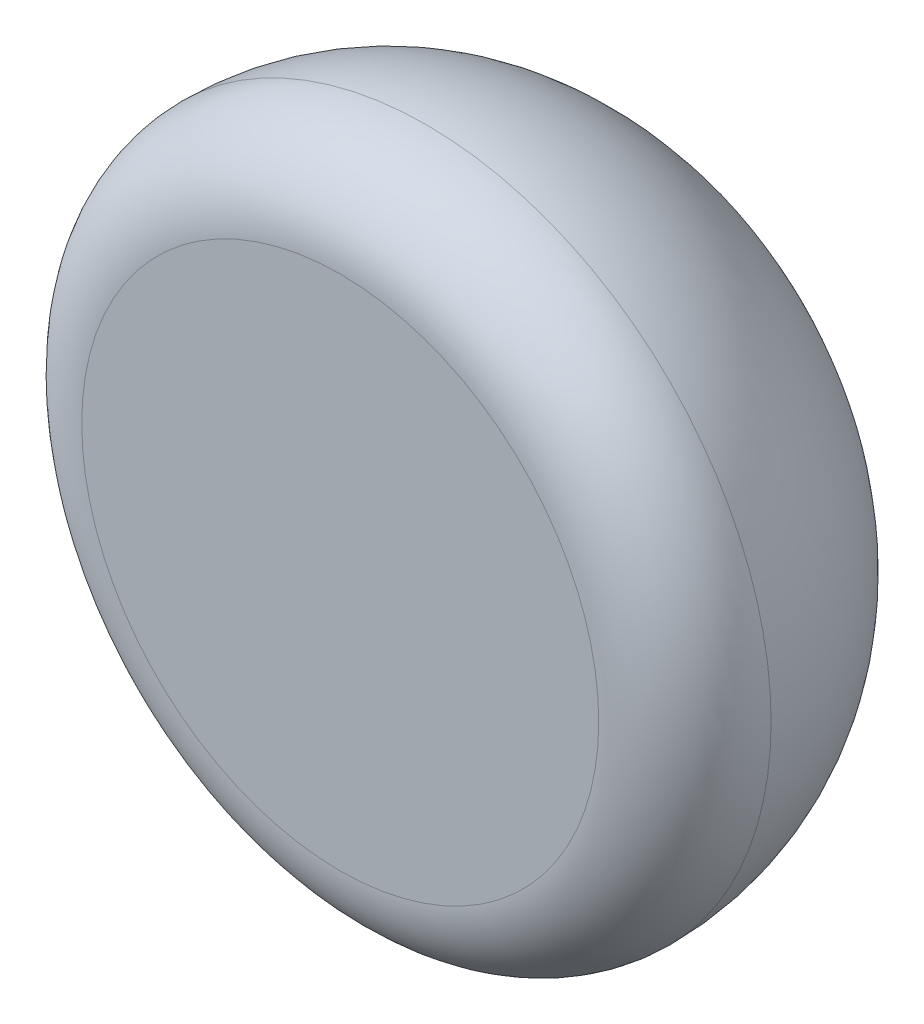
ISO-10303-21;
HEADER;
FILE_DESCRIPTION(('STEP AP214'),'2;1');
FILE_NAME('part.step','',(''),(''),'','','');
FILE_SCHEMA(('AUTOMOTIVE_DESIGN { 1 0 10303 214 1 1 1 1 }'));
ENDSEC;
DATA;
#1=APPLICATION_CONTEXT('core data for automotive mechanical design processes');
#2=APPLICATION_PROTOCOL_DEFINITION('international standard','automotive_design',2000,#1);
#3=PRODUCT_CONTEXT('',#1,'mechanical');
#4=PRODUCT('Part','Part','',(#3));
#5=PRODUCT_RELATED_PRODUCT_CATEGORY('part','',(#4));
#6=PRODUCT_DEFINITION_FORMATION('','',#4);
#7=PRODUCT_DEFINITION_CONTEXT('part definition',#1,'design');
#8=PRODUCT_DEFINITION('design','',#6,#7);
#9=PRODUCT_DEFINITION_SHAPE('','',#8);
#10=(LENGTH_UNIT() NAMED_UNIT(*) SI_UNIT(.MILLI.,.METRE.));
#11=(NAMED_UNIT(*) PLANE_ANGLE_UNIT() SI_UNIT($,.RADIAN.));
#12=(NAMED_UNIT(*) SI_UNIT($,.STERADIAN.) SOLID_ANGLE_UNIT());
#13=UNCERTAINTY_MEASURE_WITH_UNIT(LENGTH_MEASURE(1.E-05),#10,'distance_accuracy_value','');
#14=(GEOMETRIC_REPRESENTATION_CONTEXT(3) GLOBAL_UNCERTAINTY_ASSIGNED_CONTEXT((#13)) GLOBAL_UNIT_ASSIGNED_CONTEXT((#10,
#11,#12)) REPRESENTATION_CONTEXT('',''));
#15=CARTESIAN_POINT('',(0.,0.,0.));
#16=DIRECTION('',(0.,0.,1.));
#17=DIRECTION('',(1.,0.,0.));
#18=AXIS2_PLACEMENT_3D('',#15,#16,#17);
#19=CARTESIAN_POINT('',(62.0880982023196,10.2744650359823,19.1566053539786));
#20=DIRECTION('',(0.,0.,1.));
#21=DIRECTION('',(1.,0.,0.));
#22=AXIS2_PLACEMENT_3D('',#19,#20,#21);
#23=PLANE('',#22);
#24=CARTESIAN_POINT('',(62.0880982023196,10.2744650359823,19.1566053539786));
#25=DIRECTION('',(0.,0.,1.));
#26=DIRECTION('',(1.,0.,0.));
#27=AXIS2_PLACEMENT_3D('',#24,#25,#26);
#28=CIRCLE('',#27,1.8843068640524);
#29=CARTESIAN_POINT('',(63.972405066372,10.2744650359823,19.1566053539786));
#30=VERTEX_POINT('',#29);
#31=EDGE_CURVE('E176',#30,#30,#28,.T.);
#32=ORIENTED_EDGE('',*,*,#31,.T.);
#33=EDGE_LOOP('',(#32));
#34=FACE_BOUND('',#33,.T.);
#35=CARTESIAN_POINT('',(62.0880982023196,10.2744650359823,19.1566053539786));
#36=DIRECTION('',(0.,0.,1.));
#37=DIRECTION('',(1.,0.,0.));
#38=AXIS2_PLACEMENT_3D('',#35,#36,#37);
#39=CIRCLE('',#38,1.9043068640524);
#40=CARTESIAN_POINT('',(63.9924050663721,10.2744650359823,19.1566053539786));
#41=VERTEX_POINT('',#40);
#42=EDGE_CURVE('E162',#41,#41,#39,.T.);
#43=ORIENTED_EDGE('',*,*,#42,.F.);
#44=EDGE_LOOP('',(#43));
#45=FACE_BOUND('',#44,.T.);
#46=ADVANCED_FACE('F49',(#34,#45),#23,.F.);
#47=CARTESIAN_POINT('',(37.1954237547747,37.1954237547747,19.1566053539786));
#48=DIRECTION('',(0.707106781186547,0.707106781186547,0.));
#49=DIRECTION('',(-0.707106781186548,0.707106781186548,0.));
#50=AXIS2_PLACEMENT_3D('',#47,#48,#49);
#51=PLANE('',#50);
#52=DIRECTION('',(0.707106781186548,-0.707106781186548,0.));
#53=VECTOR('',#52,1.);
#54=CARTESIAN_POINT('',(37.1954237547747,37.1954237547747,15.1566053539786));
#55=LINE('',#54,#53);
#56=CARTESIAN_POINT('',(62.8463824735671,11.5444650359823,15.1566053539786));
#57=VERTEX_POINT('',#56);
#58=CARTESIAN_POINT('',(63.3580982023196,11.0327493072298,15.1566053539786));
#59=VERTEX_POINT('',#58);
#60=EDGE_CURVE('E161',#57,#59,#55,.T.);
#61=ORIENTED_EDGE('',*,*,#60,.T.);
#62=DIRECTION('',(0.,0.,-1.));
#63=VECTOR('',#62,1.);
#64=CARTESIAN_POINT('',(63.3580982023196,11.0327493072298,19.1566053539786));
#65=LINE('',#64,#63);
#66=CARTESIAN_POINT('',(63.3580982023196,11.0327493072298,19.1566053539786));
#67=VERTEX_POINT('',#66);
#68=EDGE_CURVE('E187',#67,#59,#65,.T.);
#69=ORIENTED_EDGE('',*,*,#68,.F.);
#70=DIRECTION('',(0.707106781186548,-0.707106781186548,0.));
#71=VECTOR('',#70,1.);
#72=CARTESIAN_POINT('',(37.1954237547747,37.1954237547747,19.1566053539786));
#73=LINE('',#72,#71);
#74=CARTESIAN_POINT('',(62.8463824735671,11.5444650359823,19.1566053539786));
#75=VERTEX_POINT('',#74);
#76=EDGE_CURVE('E264',#75,#67,#73,.T.);
#77=ORIENTED_EDGE('',*,*,#76,.F.);
#78=DIRECTION('',(0.,0.,-1.));
#79=VECTOR('',#78,1.);
#80=CARTESIAN_POINT('',(62.8463824735671,11.5444650359823,19.1566053539786));
#81=LINE('',#80,#79);
#82=EDGE_CURVE('E157',#75,#57,#81,.T.);
#83=ORIENTED_EDGE('',*,*,#82,.T.);
#84=EDGE_LOOP('',(#61,#69,#77,#83));
#85=FACE_BOUND('',#84,.T.);
#86=ADVANCED_FACE('F213',(#85),#51,.F.);
#87=CARTESIAN_POINT('',(63.3580982023196,0.,19.1566053539786));
#88=DIRECTION('',(1.,0.,0.));
#89=DIRECTION('',(0.,0.,-1.));
#90=AXIS2_PLACEMENT_3D('',#87,#88,#89);
#91=PLANE('',#90);
#92=DIRECTION('',(0.,-1.,0.));
#93=VECTOR('',#92,1.);
#94=CARTESIAN_POINT('',(63.3580982023196,0.,15.1566053539786));
#95=LINE('',#94,#93);
#96=CARTESIAN_POINT('',(63.3580982023196,9.51618076473488,15.1566053539786));
#97=VERTEX_POINT('',#96);
#98=EDGE_CURVE('E165',#59,#97,#95,.T.);
#99=ORIENTED_EDGE('',*,*,#98,.T.);
#100=DIRECTION('',(0.,0.,-1.));
#101=VECTOR('',#100,1.);
#102=CARTESIAN_POINT('',(63.3580982023196,9.51618076473488,19.1566053539786));
#103=LINE('',#102,#101);
#104=CARTESIAN_POINT('',(63.3580982023196,9.51618076473488,19.1566053539786));
#105=VERTEX_POINT('',#104);
#106=EDGE_CURVE('E184',#105,#97,#103,.T.);
#107=ORIENTED_EDGE('',*,*,#106,.F.);
#108=DIRECTION('',(0.,-1.,0.));
#109=VECTOR('',#108,1.);
#110=CARTESIAN_POINT('',(63.3580982023196,0.,19.1566053539786));
#111=LINE('',#110,#109);
#112=EDGE_CURVE('E109',#67,#105,#111,.T.);
#113=ORIENTED_EDGE('',*,*,#112,.F.);
#114=ORIENTED_EDGE('',*,*,#68,.T.);
#115=EDGE_LOOP('',(#99,#107,#113,#114));
#116=FACE_BOUND('',#115,.T.);
#117=ADVANCED_FACE('F218',(#116),#91,.F.);
#118=CARTESIAN_POINT('',(26.9209587187924,-26.9209587187924,19.1566053539786));
#119=DIRECTION('',(0.707106781186547,-0.707106781186547,0.));
#120=DIRECTION('',(0.707106781186548,0.707106781186548,0.));
#121=AXIS2_PLACEMENT_3D('',#118,#119,#120);
#122=PLANE('',#121);
#123=DIRECTION('',(-0.707106781186548,-0.707106781186548,0.));
#124=VECTOR('',#123,1.);
#125=CARTESIAN_POINT('',(26.9209587187924,-26.9209587187924,15.1566053539786));
#126=LINE('',#125,#124);
#127=CARTESIAN_POINT('',(62.8463824735671,9.00446503598234,15.1566053539786));
#128=VERTEX_POINT('',#127);
#129=EDGE_CURVE('E167',#97,#128,#126,.T.);
#130=ORIENTED_EDGE('',*,*,#129,.T.);
#131=DIRECTION('',(0.,0.,-1.));
#132=VECTOR('',#131,1.);
#133=CARTESIAN_POINT('',(62.8463824735671,9.00446503598234,19.1566053539786));
#134=LINE('',#133,#132);
#135=CARTESIAN_POINT('',(62.8463824735671,9.00446503598234,19.1566053539786));
#136=VERTEX_POINT('',#135);
#137=EDGE_CURVE('E181',#136,#128,#134,.T.);
#138=ORIENTED_EDGE('',*,*,#137,.F.);
#139=DIRECTION('',(-0.707106781186548,-0.707106781186548,0.));
#140=VECTOR('',#139,1.);
#141=CARTESIAN_POINT('',(26.9209587187924,-26.9209587187924,19.1566053539786));
#142=LINE('',#141,#140);
#143=EDGE_CURVE('E150',#105,#136,#142,.T.);
#144=ORIENTED_EDGE('',*,*,#143,.F.);
#145=ORIENTED_EDGE('',*,*,#106,.T.);
#146=EDGE_LOOP('',(#130,#138,#144,#145));
#147=FACE_BOUND('',#146,.T.);
#148=ADVANCED_FACE('F251',(#147),#122,.F.);
#149=CARTESIAN_POINT('',(0.,9.00446503598234,19.1566053539786));
#150=DIRECTION('',(0.,-1.,0.));
#151=DIRECTION('',(0.,0.,-1.));
#152=AXIS2_PLACEMENT_3D('',#149,#150,#151);
#153=PLANE('',#152);
#154=DIRECTION('',(-1.,0.,0.));
#155=VECTOR('',#154,1.);
#156=CARTESIAN_POINT('',(0.,9.00446503598234,15.1566053539786));
#157=LINE('',#156,#155);
#158=CARTESIAN_POINT('',(61.3298139310722,9.00446503598234,15.1566053539786));
#159=VERTEX_POINT('',#158);
#160=EDGE_CURVE('E169',#128,#159,#157,.T.);
#161=ORIENTED_EDGE('',*,*,#160,.T.);
#162=DIRECTION('',(0.,0.,-1.));
#163=VECTOR('',#162,1.);
#164=CARTESIAN_POINT('',(61.3298139310722,9.00446503598234,19.1566053539786));
#165=LINE('',#164,#163);
#166=CARTESIAN_POINT('',(61.3298139310722,9.00446503598234,19.1566053539786));
#167=VERTEX_POINT('',#166);
#168=EDGE_CURVE('E134',#167,#159,#165,.T.);
#169=ORIENTED_EDGE('',*,*,#168,.F.);
#170=DIRECTION('',(-1.,0.,0.));
#171=VECTOR('',#170,1.);
#172=CARTESIAN_POINT('',(0.,9.00446503598234,19.1566053539786));
#173=LINE('',#172,#171);
#174=EDGE_CURVE('E148',#136,#167,#173,.T.);
#175=ORIENTED_EDGE('',*,*,#174,.F.);
#176=ORIENTED_EDGE('',*,*,#137,.T.);
#177=EDGE_LOOP('',(#161,#169,#175,#176));
#178=FACE_BOUND('',#177,.T.);
#179=ADVANCED_FACE('F248',(#178),#153,.F.);
#180=CARTESIAN_POINT('',(35.1671394835273,35.1671394835273,19.1566053539786));
#181=DIRECTION('',(-0.707106781186547,-0.707106781186547,0.));
#182=DIRECTION('',(0.707106781186548,-0.707106781186548,0.));
#183=AXIS2_PLACEMENT_3D('',#180,#181,#182);
#184=PLANE('',#183);
#185=DIRECTION('',(-0.707106781186548,0.707106781186548,0.));
#186=VECTOR('',#185,1.);
#187=CARTESIAN_POINT('',(35.1671394835273,35.1671394835273,15.1566053539786));
#188=LINE('',#187,#186);
#189=CARTESIAN_POINT('',(60.8180982023196,9.51618076473487,15.1566053539786));
#190=VERTEX_POINT('',#189);
#191=EDGE_CURVE('E131',#159,#190,#188,.T.);
#192=ORIENTED_EDGE('',*,*,#191,.T.);
#193=DIRECTION('',(0.,0.,-1.));
#194=VECTOR('',#193,1.);
#195=CARTESIAN_POINT('',(60.8180982023196,9.51618076473487,19.1566053539786));
#196=LINE('',#195,#194);
#197=CARTESIAN_POINT('',(60.8180982023196,9.51618076473487,19.1566053539786));
#198=VERTEX_POINT('',#197);
#199=EDGE_CURVE('E123',#198,#190,#196,.T.);
#200=ORIENTED_EDGE('',*,*,#199,.F.);
#201=DIRECTION('',(-0.707106781186548,0.707106781186548,0.));
#202=VECTOR('',#201,1.);
#203=CARTESIAN_POINT('',(35.1671394835273,35.1671394835273,19.1566053539786));
#204=LINE('',#203,#202);
#205=EDGE_CURVE('E128',#167,#198,#204,.T.);
#206=ORIENTED_EDGE('',*,*,#205,.F.);
#207=ORIENTED_EDGE('',*,*,#168,.T.);
#208=EDGE_LOOP('',(#192,#200,#206,#207));
#209=FACE_BOUND('',#208,.T.);
#210=ADVANCED_FACE('F125',(#209),#184,.F.);
#211=CARTESIAN_POINT('',(60.8180982023196,0.,19.1566053539786));
#212=DIRECTION('',(-1.,0.,0.));
#213=DIRECTION('',(0.,0.,1.));
#214=AXIS2_PLACEMENT_3D('',#211,#212,#213);
#215=PLANE('',#214);
#216=DIRECTION('',(0.,1.,0.));
#217=VECTOR('',#216,1.);
#218=CARTESIAN_POINT('',(60.8180982023196,0.,15.1566053539786));
#219=LINE('',#218,#217);
#220=CARTESIAN_POINT('',(60.8180982023196,11.0327493072298,15.1566053539786));
#221=VERTEX_POINT('',#220);
#222=EDGE_CURVE('E172',#190,#221,#219,.T.);
#223=ORIENTED_EDGE('',*,*,#222,.T.);
#224=DIRECTION('',(0.,0.,-1.));
#225=VECTOR('',#224,1.);
#226=CARTESIAN_POINT('',(60.8180982023196,11.0327493072298,19.1566053539786));
#227=LINE('',#226,#225);
#228=CARTESIAN_POINT('',(60.8180982023196,11.0327493072298,19.1566053539786));
#229=VERTEX_POINT('',#228);
#230=EDGE_CURVE('E135',#229,#221,#227,.T.);
#231=ORIENTED_EDGE('',*,*,#230,.F.);
#232=DIRECTION('',(0.,1.,0.));
#233=VECTOR('',#232,1.);
#234=CARTESIAN_POINT('',(60.8180982023196,0.,19.1566053539786));
#235=LINE('',#234,#233);
#236=EDGE_CURVE('E138',#198,#229,#235,.T.);
#237=ORIENTED_EDGE('',*,*,#236,.F.);
#238=ORIENTED_EDGE('',*,*,#199,.T.);
#239=EDGE_LOOP('',(#223,#231,#237,#238));
#240=FACE_BOUND('',#239,.T.);
#241=ADVANCED_FACE('F139',(#240),#215,.F.);
#242=CARTESIAN_POINT('',(24.8926744475449,-24.8926744475449,19.1566053539786));
#243=DIRECTION('',(-0.707106781186547,0.707106781186547,0.));
#244=DIRECTION('',(-0.707106781186548,-0.707106781186548,0.));
#245=AXIS2_PLACEMENT_3D('',#242,#243,#244);
#246=PLANE('',#245);
#247=DIRECTION('',(0.707106781186548,0.707106781186548,0.));
#248=VECTOR('',#247,1.);
#249=CARTESIAN_POINT('',(24.8926744475449,-24.8926744475449,15.1566053539786));
#250=LINE('',#249,#248);
#251=CARTESIAN_POINT('',(61.3298139310722,11.5444650359823,15.1566053539786));
#252=VERTEX_POINT('',#251);
#253=EDGE_CURVE('E94',#221,#252,#250,.T.);
#254=ORIENTED_EDGE('',*,*,#253,.T.);
#255=DIRECTION('',(0.,0.,-1.));
#256=VECTOR('',#255,1.);
#257=CARTESIAN_POINT('',(61.3298139310722,11.5444650359823,19.1566053539786));
#258=LINE('',#257,#256);
#259=CARTESIAN_POINT('',(61.3298139310722,11.5444650359823,19.1566053539786));
#260=VERTEX_POINT('',#259);
#261=EDGE_CURVE('E66',#260,#252,#258,.T.);
#262=ORIENTED_EDGE('',*,*,#261,.F.);
#263=DIRECTION('',(0.707106781186548,0.707106781186548,0.));
#264=VECTOR('',#263,1.);
#265=CARTESIAN_POINT('',(24.8926744475449,-24.8926744475449,19.1566053539786));
#266=LINE('',#265,#264);
#267=EDGE_CURVE('E142',#229,#260,#266,.T.);
#268=ORIENTED_EDGE('',*,*,#267,.F.);
#269=ORIENTED_EDGE('',*,*,#230,.T.);
#270=EDGE_LOOP('',(#254,#262,#268,#269));
#271=FACE_BOUND('',#270,.T.);
#272=ADVANCED_FACE('F241',(#271),#246,.F.);
#273=CARTESIAN_POINT('',(62.0880982023196,10.2744650359823,19.1566053539786));
#274=DIRECTION('',(0.,0.,-1.));
#275=DIRECTION('',(-1.,0.,0.));
#276=AXIS2_PLACEMENT_3D('',#273,#274,#275);
#277=CYLINDRICAL_SURFACE('',#276,1.8843068640524);
#278=ORIENTED_EDGE('',*,*,#31,.F.);
#279=EDGE_LOOP('',(#278));
#280=FACE_BOUND('',#279,.T.);
#281=CARTESIAN_POINT('',(62.0880982023196,10.2744650359823,15.1566053539786));
#282=DIRECTION('',(0.,0.,1.));
#283=DIRECTION('',(1.,0.,0.));
#284=AXIS2_PLACEMENT_3D('',#281,#282,#283);
#285=CIRCLE('',#284,1.8843068640524);
#286=CARTESIAN_POINT('',(63.972405066372,10.2744650359823,15.1566053539786));
#287=VERTEX_POINT('',#286);
#288=EDGE_CURVE('E158',#287,#287,#285,.T.);
#289=ORIENTED_EDGE('',*,*,#288,.T.);
#290=EDGE_LOOP('',(#289));
#291=FACE_BOUND('',#290,.T.);
#292=ADVANCED_FACE('F236',(#280,#291),#277,.T.);
#293=CARTESIAN_POINT('',(0.,11.5444650359823,19.1566053539786));
#294=DIRECTION('',(0.,1.,0.));
#295=DIRECTION('',(0.,0.,1.));
#296=AXIS2_PLACEMENT_3D('',#293,#294,#295);
#297=PLANE('',#296);
#298=DIRECTION('',(1.,0.,0.));
#299=VECTOR('',#298,1.);
#300=CARTESIAN_POINT('',(0.,11.5444650359823,15.1566053539786));
#301=LINE('',#300,#299);
#302=EDGE_CURVE('E100',#252,#57,#301,.T.);
#303=ORIENTED_EDGE('',*,*,#302,.T.);
#304=ORIENTED_EDGE('',*,*,#82,.F.);
#305=DIRECTION('',(1.,0.,0.));
#306=VECTOR('',#305,1.);
#307=CARTESIAN_POINT('',(0.,11.5444650359823,19.1566053539786));
#308=LINE('',#307,#306);
#309=EDGE_CURVE('E155',#260,#75,#308,.T.);
#310=ORIENTED_EDGE('',*,*,#309,.F.);
#311=ORIENTED_EDGE('',*,*,#261,.T.);
#312=EDGE_LOOP('',(#303,#304,#310,#311));
#313=FACE_BOUND('',#312,.T.);
#314=ADVANCED_FACE('F231',(#313),#297,.F.);
#315=CARTESIAN_POINT('',(0.,0.,15.1566053539786));
#316=DIRECTION('',(0.,0.,1.));
#317=DIRECTION('',(1.,0.,0.));
#318=AXIS2_PLACEMENT_3D('',#315,#316,#317);
#319=PLANE('',#318);
#320=ORIENTED_EDGE('',*,*,#288,.F.);
#321=EDGE_LOOP('',(#320));
#322=FACE_BOUND('',#321,.T.);
#323=ORIENTED_EDGE('',*,*,#60,.F.);
#324=ORIENTED_EDGE('',*,*,#302,.F.);
#325=ORIENTED_EDGE('',*,*,#253,.F.);
#326=ORIENTED_EDGE('',*,*,#222,.F.);
#327=ORIENTED_EDGE('',*,*,#191,.F.);
#328=ORIENTED_EDGE('',*,*,#160,.F.);
#329=ORIENTED_EDGE('',*,*,#129,.F.);
#330=ORIENTED_EDGE('',*,*,#98,.F.);
#331=EDGE_LOOP('',(#323,#324,#325,#326,#327,#328,#329,#330));
#332=FACE_BOUND('',#331,.T.);
#333=ADVANCED_FACE('F225',(#322,#332),#319,.F.);
#334=ORIENTED_EDGE('',*,*,#309,.T.);
#335=ORIENTED_EDGE('',*,*,#76,.T.);
#336=ORIENTED_EDGE('',*,*,#112,.T.);
#337=ORIENTED_EDGE('',*,*,#143,.T.);
#338=ORIENTED_EDGE('',*,*,#174,.T.);
#339=ORIENTED_EDGE('',*,*,#205,.T.);
#340=ORIENTED_EDGE('',*,*,#236,.T.);
#341=ORIENTED_EDGE('',*,*,#267,.T.);
#342=EDGE_LOOP('',(#334,#335,#336,#337,#338,#339,#340,#341));
#343=FACE_BOUND('',#342,.T.);
#344=ADVANCED_FACE('F145',(#343),#23,.F.);
#345=CARTESIAN_POINT('',(62.0880982023196,10.2744650359823,19.1566053539786));
#346=DIRECTION('',(0.,0.,-1.));
#347=DIRECTION('',(-1.,0.,0.));
#348=AXIS2_PLACEMENT_3D('',#345,#346,#347);
#349=CYLINDRICAL_SURFACE('',#348,1.9043068640524);
#350=ORIENTED_EDGE('',*,*,#42,.T.);
#351=EDGE_LOOP('',(#350));
#352=FACE_BOUND('',#351,.T.);
#353=CARTESIAN_POINT('',(62.0880982023196,10.2744650359823,14.1566053539786));
#354=DIRECTION('',(0.,0.,1.));
#355=DIRECTION('',(1.,0.,0.));
#356=AXIS2_PLACEMENT_3D('',#353,#354,#355);
#357=CIRCLE('',#356,1.9043068640524);
#358=CARTESIAN_POINT('',(63.9924050663721,10.2744650359823,14.1566053539786));
#359=VERTEX_POINT('',#358);
#360=EDGE_CURVE('E277',#359,#359,#357,.T.);
#361=ORIENTED_EDGE('',*,*,#360,.F.);
#362=EDGE_LOOP('',(#361));
#363=FACE_BOUND('',#362,.T.);
#364=ADVANCED_FACE('F207',(#352,#363),#349,.F.);
#365=CARTESIAN_POINT('',(62.0880982023196,10.2744650359823,14.1566053539786));
#366=DIRECTION('',(0.,0.,1.));
#367=DIRECTION('',(1.,0.,0.));
#368=AXIS2_PLACEMENT_3D('',#365,#366,#367);
#369=PLANE('',#368);
#370=CARTESIAN_POINT('',(62.0880982023196,10.2744650359823,14.1566053539786));
#371=DIRECTION('',(0.,0.,1.));
#372=DIRECTION('',(1.,0.,0.));
#373=AXIS2_PLACEMENT_3D('',#370,#371,#372);
#374=CIRCLE('',#373,2.00000000000001);
#375=CARTESIAN_POINT('',(64.0880982023197,10.2744650359823,14.1566053539786));
#376=VERTEX_POINT('',#375);
#377=EDGE_CURVE('E12',#376,#376,#374,.F.);
#378=ORIENTED_EDGE('',*,*,#377,.T.);
#379=EDGE_LOOP('',(#378));
#380=FACE_BOUND('',#379,.T.);
#381=ORIENTED_EDGE('',*,*,#360,.T.);
#382=EDGE_LOOP('',(#381));
#383=FACE_BOUND('',#382,.T.);
#384=ADVANCED_FACE('F202',(#380,#383),#369,.F.);
#385=CARTESIAN_POINT('',(62.0880982023196,10.2744650359823,22.1566053539786));
#386=DIRECTION('',(0.,0.,1.));
#387=DIRECTION('',(1.,0.,0.));
#388=AXIS2_PLACEMENT_3D('',#385,#386,#387);
#389=PLANE('',#388);
#390=CARTESIAN_POINT('',(62.0880982023196,10.2744650359823,22.1566053539786));
#391=DIRECTION('',(0.,0.,1.));
#392=DIRECTION('',(1.,0.,0.));
#393=AXIS2_PLACEMENT_3D('',#390,#391,#392);
#394=CIRCLE('',#393,6.00000000000001);
#395=CARTESIAN_POINT('',(68.0880982023196,10.2744650359823,22.1566053539786));
#396=VERTEX_POINT('',#395);
#397=EDGE_CURVE('E189',#396,#396,#394,.T.);
#398=ORIENTED_EDGE('',*,*,#397,.T.);
#399=EDGE_LOOP('',(#398));
#400=FACE_BOUND('',#399,.T.);
#401=ADVANCED_FACE('F198',(#400),#389,.T.);
#402=CARTESIAN_POINT('',(62.0880982023196,10.2744650359823,20.1566053539786));
#403=DIRECTION('',(0.,0.,1.));
#404=DIRECTION('',(1.,0.,0.));
#405=AXIS2_PLACEMENT_3D('',#402,#403,#404);
#406=TOROIDAL_SURFACE('',#405,6.00000000000001,2.);
#407=CARTESIAN_POINT('',(62.0880982023196,10.2744650359823,20.1566053539786));
#408=DIRECTION('',(0.,0.,1.));
#409=DIRECTION('',(1.,0.,0.));
#410=AXIS2_PLACEMENT_3D('',#407,#408,#409);
#411=CIRCLE('',#410,8.00000000000001);
#412=CARTESIAN_POINT('',(70.0880982023196,10.2744650359823,20.1566053539786));
#413=VERTEX_POINT('',#412);
#414=EDGE_CURVE('E58',#413,#413,#411,.F.);
#415=ORIENTED_EDGE('',*,*,#414,.F.);
#416=EDGE_LOOP('',(#415));
#417=FACE_BOUND('',#416,.T.);
#418=ORIENTED_EDGE('',*,*,#397,.F.);
#419=EDGE_LOOP('',(#418));
#420=FACE_BOUND('',#419,.T.);
#421=ADVANCED_FACE('F195',(#417,#420),#406,.T.);
#422=CARTESIAN_POINT('',(62.0880982023196,10.2744650359823,20.1566053539786));
#423=DIRECTION('',(0.,0.,1.));
#424=DIRECTION('',(1.,0.,0.));
#425=AXIS2_PLACEMENT_3D('',#422,#423,#424);
#426=DEGENERATE_TOROIDAL_SURFACE('',#425,2.00000000000001,6.,.T.);
#427=ORIENTED_EDGE('',*,*,#377,.F.);
#428=EDGE_LOOP('',(#427));
#429=FACE_BOUND('',#428,.T.);
#430=ORIENTED_EDGE('',*,*,#414,.T.);
#431=EDGE_LOOP('',(#430));
#432=FACE_BOUND('',#431,.T.);
#433=ADVANCED_FACE('F51',(#429,#432),#426,.T.);
#434=CLOSED_SHELL('',(#46,#86,#117,#148,#179,#210,#241,#272,#292,#314,#333,#344,#364,#384,#401,
#421,#433));
#435=MANIFOLD_SOLID_BREP('B2',#434);
#436=ADVANCED_BREP_SHAPE_REPRESENTATION('',(#18,#435),#14);
#437=SHAPE_DEFINITION_REPRESENTATION(#9,#436);
ENDSEC;
END-ISO-10303-21;
